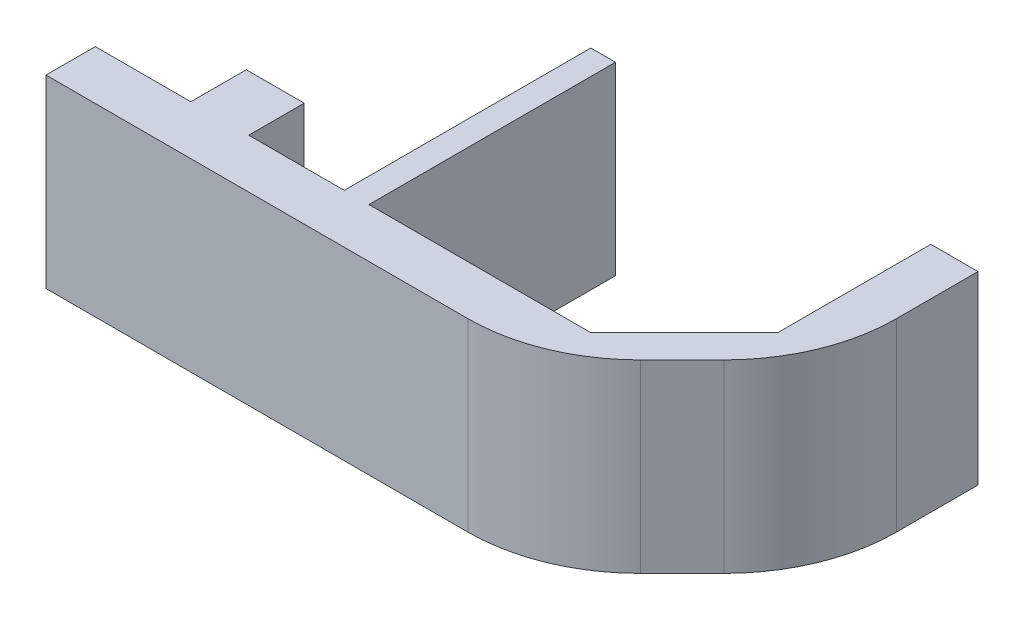
ISO-10303-21;
HEADER;
FILE_DESCRIPTION(('STEP AP214'),'2;1');
FILE_NAME('part.step','',(''),(''),'','','');
FILE_SCHEMA(('AUTOMOTIVE_DESIGN { 1 0 10303 214 1 1 1 1 }'));
ENDSEC;
DATA;
#1=APPLICATION_CONTEXT('core data for automotive mechanical design processes');
#2=APPLICATION_PROTOCOL_DEFINITION('international standard','automotive_design',2000,#1);
#3=PRODUCT_CONTEXT('',#1,'mechanical');
#4=PRODUCT('Part','Part','',(#3));
#5=PRODUCT_RELATED_PRODUCT_CATEGORY('part','',(#4));
#6=PRODUCT_DEFINITION_FORMATION('','',#4);
#7=PRODUCT_DEFINITION_CONTEXT('part definition',#1,'design');
#8=PRODUCT_DEFINITION('design','',#6,#7);
#9=PRODUCT_DEFINITION_SHAPE('','',#8);
#10=(LENGTH_UNIT() NAMED_UNIT(*) SI_UNIT(.MILLI.,.METRE.));
#11=(NAMED_UNIT(*) PLANE_ANGLE_UNIT() SI_UNIT($,.RADIAN.));
#12=(NAMED_UNIT(*) SI_UNIT($,.STERADIAN.) SOLID_ANGLE_UNIT());
#13=UNCERTAINTY_MEASURE_WITH_UNIT(LENGTH_MEASURE(1.E-05),#10,'distance_accuracy_value','');
#14=(GEOMETRIC_REPRESENTATION_CONTEXT(3) GLOBAL_UNCERTAINTY_ASSIGNED_CONTEXT((#13)) GLOBAL_UNIT_ASSIGNED_CONTEXT((#10,
#11,#12)) REPRESENTATION_CONTEXT('',''));
#15=CARTESIAN_POINT('',(0.,0.,0.));
#16=DIRECTION('',(0.,0.,1.));
#17=DIRECTION('',(1.,0.,0.));
#18=AXIS2_PLACEMENT_3D('',#15,#16,#17);
#19=CARTESIAN_POINT('',(-22.8017231924407,15.,-2.35925925925926));
#20=DIRECTION('',(0.,0.,1.));
#21=DIRECTION('',(1.,0.,0.));
#22=AXIS2_PLACEMENT_3D('',#19,#20,#21);
#23=PLANE('',#22);
#24=DIRECTION('',(0.,-1.,0.));
#25=VECTOR('',#24,1.);
#26=CARTESIAN_POINT('',(-13.0517231924407,15.,-2.35925925925926));
#27=LINE('',#26,#25);
#28=CARTESIAN_POINT('',(-13.0517231924407,15.,-2.35925925925926));
#29=VERTEX_POINT('',#28);
#30=CARTESIAN_POINT('',(-13.0517231924407,0.,-2.35925925925926));
#31=VERTEX_POINT('',#30);
#32=EDGE_CURVE('E60',#29,#31,#27,.T.);
#33=ORIENTED_EDGE('',*,*,#32,.F.);
#34=DIRECTION('',(-1.,0.,0.));
#35=VECTOR('',#34,1.);
#36=CARTESIAN_POINT('',(-22.8017231924407,15.,-2.35925925925926));
#37=LINE('',#36,#35);
#38=CARTESIAN_POINT('',(4.94827680755932,15.,-2.35925925925926));
#39=VERTEX_POINT('',#38);
#40=EDGE_CURVE('E219',#39,#29,#37,.T.);
#41=ORIENTED_EDGE('',*,*,#40,.F.);
#42=DIRECTION('',(0.,-1.,0.));
#43=VECTOR('',#42,1.);
#44=CARTESIAN_POINT('',(4.94827680755932,15.,-2.35925925925926));
#45=LINE('',#44,#43);
#46=CARTESIAN_POINT('',(4.94827680755932,0.,-2.35925925925926));
#47=VERTEX_POINT('',#46);
#48=EDGE_CURVE('E257',#39,#47,#45,.T.);
#49=ORIENTED_EDGE('',*,*,#48,.T.);
#50=DIRECTION('',(-1.,0.,0.));
#51=VECTOR('',#50,1.);
#52=CARTESIAN_POINT('',(-22.8017231924407,0.,-2.35925925925926));
#53=LINE('',#52,#51);
#54=EDGE_CURVE('E244',#47,#31,#53,.T.);
#55=ORIENTED_EDGE('',*,*,#54,.T.);
#56=EDGE_LOOP('',(#33,#41,#49,#55));
#57=FACE_BOUND('',#56,.T.);
#58=ADVANCED_FACE('F37',(#57),#23,.F.);
#59=DIRECTION('',(0.,1.,0.));
#60=VECTOR('',#59,1.);
#61=CARTESIAN_POINT('',(-15.0517231924407,15.,-2.35925925925926));
#62=LINE('',#61,#60);
#63=CARTESIAN_POINT('',(-15.0517231924407,0.,-2.35925925925926));
#64=VERTEX_POINT('',#63);
#65=CARTESIAN_POINT('',(-15.0517231924407,15.,-2.35925925925926));
#66=VERTEX_POINT('',#65);
#67=EDGE_CURVE('E185',#64,#66,#62,.T.);
#68=ORIENTED_EDGE('',*,*,#67,.F.);
#69=CARTESIAN_POINT('',(-22.8017231924407,0.,-2.35925925925926));
#70=VERTEX_POINT('',#69);
#71=EDGE_CURVE('E243',#64,#70,#53,.T.);
#72=ORIENTED_EDGE('',*,*,#71,.T.);
#73=DIRECTION('',(0.,-1.,0.));
#74=VECTOR('',#73,1.);
#75=CARTESIAN_POINT('',(-22.8017231924407,15.,-2.35925925925926));
#76=LINE('',#75,#74);
#77=CARTESIAN_POINT('',(-22.8017231924407,15.,-2.35925925925926));
#78=VERTEX_POINT('',#77);
#79=EDGE_CURVE('E254',#78,#70,#76,.T.);
#80=ORIENTED_EDGE('',*,*,#79,.F.);
#81=EDGE_CURVE('E52',#66,#78,#37,.T.);
#82=ORIENTED_EDGE('',*,*,#81,.F.);
#83=EDGE_LOOP('',(#68,#72,#80,#82));
#84=FACE_BOUND('',#83,.T.);
#85=ADVANCED_FACE('F329',(#84),#23,.F.);
#86=CARTESIAN_POINT('',(-27.5017231924407,15.,-6.85925925925926));
#87=DIRECTION('',(1.,0.,0.));
#88=DIRECTION('',(0.,0.,-1.));
#89=AXIS2_PLACEMENT_3D('',#86,#87,#88);
#90=PLANE('',#89);
#91=DIRECTION('',(0.,0.,1.));
#92=VECTOR('',#91,1.);
#93=CARTESIAN_POINT('',(-27.5017231924407,0.,-6.85925925925926));
#94=LINE('',#93,#92);
#95=CARTESIAN_POINT('',(-27.5017231924407,0.,-6.85925925925926));
#96=VERTEX_POINT('',#95);
#97=CARTESIAN_POINT('',(-27.5017231924407,0.,-2.35925925925926));
#98=VERTEX_POINT('',#97);
#99=EDGE_CURVE('E188',#96,#98,#94,.T.);
#100=ORIENTED_EDGE('',*,*,#99,.T.);
#101=DIRECTION('',(0.,-1.,0.));
#102=VECTOR('',#101,1.);
#103=CARTESIAN_POINT('',(-27.5017231924407,15.,-2.35925925925926));
#104=LINE('',#103,#102);
#105=CARTESIAN_POINT('',(-27.5017231924407,15.,-2.35925925925926));
#106=VERTEX_POINT('',#105);
#107=EDGE_CURVE('E275',#106,#98,#104,.T.);
#108=ORIENTED_EDGE('',*,*,#107,.F.);
#109=DIRECTION('',(0.,0.,1.));
#110=VECTOR('',#109,1.);
#111=CARTESIAN_POINT('',(-27.5017231924407,15.,-6.85925925925926));
#112=LINE('',#111,#110);
#113=CARTESIAN_POINT('',(-27.5017231924407,15.,-6.85925925925926));
#114=VERTEX_POINT('',#113);
#115=EDGE_CURVE('E197',#114,#106,#112,.T.);
#116=ORIENTED_EDGE('',*,*,#115,.F.);
#117=DIRECTION('',(0.,-1.,0.));
#118=VECTOR('',#117,1.);
#119=CARTESIAN_POINT('',(-27.5017231924407,15.,-6.85925925925926));
#120=LINE('',#119,#118);
#121=EDGE_CURVE('E224',#114,#96,#120,.T.);
#122=ORIENTED_EDGE('',*,*,#121,.T.);
#123=EDGE_LOOP('',(#100,#108,#116,#122));
#124=FACE_BOUND('',#123,.T.);
#125=ADVANCED_FACE('F319',(#124),#90,.F.);
#126=CARTESIAN_POINT('',(-27.5017231924407,15.,-2.35925925925926));
#127=DIRECTION('',(0.,0.,1.));
#128=DIRECTION('',(1.,0.,0.));
#129=AXIS2_PLACEMENT_3D('',#126,#127,#128);
#130=PLANE('',#129);
#131=DIRECTION('',(-1.,0.,0.));
#132=VECTOR('',#131,1.);
#133=CARTESIAN_POINT('',(-27.5017231924407,0.,-2.35925925925926));
#134=LINE('',#133,#132);
#135=CARTESIAN_POINT('',(-35.2517231924407,0.,-2.35925925925926));
#136=VERTEX_POINT('',#135);
#137=EDGE_CURVE('E191',#98,#136,#134,.T.);
#138=ORIENTED_EDGE('',*,*,#137,.T.);
#139=DIRECTION('',(0.,-1.,0.));
#140=VECTOR('',#139,1.);
#141=CARTESIAN_POINT('',(-35.2517231924407,15.,-2.35925925925926));
#142=LINE('',#141,#140);
#143=CARTESIAN_POINT('',(-35.2517231924407,15.,-2.35925925925926));
#144=VERTEX_POINT('',#143);
#145=EDGE_CURVE('E272',#144,#136,#142,.T.);
#146=ORIENTED_EDGE('',*,*,#145,.F.);
#147=DIRECTION('',(-1.,0.,0.));
#148=VECTOR('',#147,1.);
#149=CARTESIAN_POINT('',(-27.5017231924407,15.,-2.35925925925926));
#150=LINE('',#149,#148);
#151=EDGE_CURVE('E200',#106,#144,#150,.T.);
#152=ORIENTED_EDGE('',*,*,#151,.F.);
#153=ORIENTED_EDGE('',*,*,#107,.T.);
#154=EDGE_LOOP('',(#138,#146,#152,#153));
#155=FACE_BOUND('',#154,.T.);
#156=ADVANCED_FACE('F316',(#155),#130,.F.);
#157=CARTESIAN_POINT('',(-35.2517231924407,15.,-2.35925925925926));
#158=DIRECTION('',(1.,0.,0.));
#159=DIRECTION('',(0.,0.,-1.));
#160=AXIS2_PLACEMENT_3D('',#157,#158,#159);
#161=PLANE('',#160);
#162=DIRECTION('',(0.,0.,1.));
#163=VECTOR('',#162,1.);
#164=CARTESIAN_POINT('',(-35.2517231924407,0.,-2.35925925925926));
#165=LINE('',#164,#163);
#166=CARTESIAN_POINT('',(-35.2517231924407,0.,1.64074074074074));
#167=VERTEX_POINT('',#166);
#168=EDGE_CURVE('E227',#136,#167,#165,.T.);
#169=ORIENTED_EDGE('',*,*,#168,.T.);
#170=DIRECTION('',(0.,-1.,0.));
#171=VECTOR('',#170,1.);
#172=CARTESIAN_POINT('',(-35.2517231924407,15.,1.64074074074074));
#173=LINE('',#172,#171);
#174=CARTESIAN_POINT('',(-35.2517231924407,15.,1.64074074074074));
#175=VERTEX_POINT('',#174);
#176=EDGE_CURVE('E269',#175,#167,#173,.T.);
#177=ORIENTED_EDGE('',*,*,#176,.F.);
#178=DIRECTION('',(0.,0.,1.));
#179=VECTOR('',#178,1.);
#180=CARTESIAN_POINT('',(-35.2517231924407,15.,-2.35925925925926));
#181=LINE('',#180,#179);
#182=EDGE_CURVE('E203',#144,#175,#181,.T.);
#183=ORIENTED_EDGE('',*,*,#182,.F.);
#184=ORIENTED_EDGE('',*,*,#145,.T.);
#185=EDGE_LOOP('',(#169,#177,#183,#184));
#186=FACE_BOUND('',#185,.T.);
#187=ADVANCED_FACE('F310',(#186),#161,.F.);
#188=CARTESIAN_POINT('',(-35.2517231924407,15.,1.64074074074074));
#189=DIRECTION('',(0.,0.,-1.));
#190=DIRECTION('',(-1.,0.,0.));
#191=AXIS2_PLACEMENT_3D('',#188,#189,#190);
#192=PLANE('',#191);
#193=DIRECTION('',(1.,0.,0.));
#194=VECTOR('',#193,1.);
#195=CARTESIAN_POINT('',(-35.2517231924407,0.,1.64074074074074));
#196=LINE('',#195,#194);
#197=CARTESIAN_POINT('',(-1.02071306566402,0.,1.64074074074074));
#198=VERTEX_POINT('',#197);
#199=EDGE_CURVE('E229',#167,#198,#196,.T.);
#200=ORIENTED_EDGE('',*,*,#199,.T.);
#201=DIRECTION('',(0.,-1.,0.));
#202=VECTOR('',#201,1.);
#203=CARTESIAN_POINT('',(-1.02071306566402,15.,1.64074074074074));
#204=LINE('',#203,#202);
#205=CARTESIAN_POINT('',(-1.02071306566402,15.,1.64074074074074));
#206=VERTEX_POINT('',#205);
#207=EDGE_CURVE('E287',#198,#206,#204,.F.);
#208=ORIENTED_EDGE('',*,*,#207,.T.);
#209=DIRECTION('',(1.,0.,0.));
#210=VECTOR('',#209,1.);
#211=CARTESIAN_POINT('',(-35.2517231924407,15.,1.64074074074074));
#212=LINE('',#211,#210);
#213=EDGE_CURVE('E205',#175,#206,#212,.T.);
#214=ORIENTED_EDGE('',*,*,#213,.F.);
#215=ORIENTED_EDGE('',*,*,#176,.T.);
#216=EDGE_LOOP('',(#200,#208,#214,#215));
#217=FACE_BOUND('',#216,.T.);
#218=ADVANCED_FACE('F306',(#217),#192,.F.);
#219=CARTESIAN_POINT('',(4.77827680755932,15.,1.64074074074074));
#220=DIRECTION('',(-0.707106781186547,0.,-0.707106781186548));
#221=DIRECTION('',(-0.707106781186548,0.,0.707106781186547));
#222=AXIS2_PLACEMENT_3D('',#219,#220,#221);
#223=PLANE('',#222);
#224=DIRECTION('',(0.707106781186548,0.,-0.707106781186547));
#225=VECTOR('',#224,1.);
#226=CARTESIAN_POINT('',(4.77827680755932,15.,1.64074074074074));
#227=LINE('',#226,#225);
#228=CARTESIAN_POINT('',(8.87878187094765,15.,-2.45976432264759));
#229=VERTEX_POINT('',#228);
#230=CARTESIAN_POINT('',(12.2611050775043,15.,-5.84208752920422));
#231=VERTEX_POINT('',#230);
#232=EDGE_CURVE('E208',#229,#231,#227,.T.);
#233=ORIENTED_EDGE('',*,*,#232,.F.);
#234=DIRECTION('',(0.,-1.,0.));
#235=VECTOR('',#234,1.);
#236=CARTESIAN_POINT('',(8.87878187094765,15.,-2.45976432264759));
#237=LINE('',#236,#235);
#238=CARTESIAN_POINT('',(8.87878187094765,0.,-2.45976432264759));
#239=VERTEX_POINT('',#238);
#240=EDGE_CURVE('E280',#229,#239,#237,.T.);
#241=ORIENTED_EDGE('',*,*,#240,.T.);
#242=DIRECTION('',(0.707106781186548,0.,-0.707106781186547));
#243=VECTOR('',#242,1.);
#244=CARTESIAN_POINT('',(4.77827680755932,0.,1.64074074074074));
#245=LINE('',#244,#243);
#246=CARTESIAN_POINT('',(12.2611050775043,0.,-5.84208752920422));
#247=VERTEX_POINT('',#246);
#248=EDGE_CURVE('E232',#239,#247,#245,.T.);
#249=ORIENTED_EDGE('',*,*,#248,.T.);
#250=DIRECTION('',(0.,-1.,0.));
#251=VECTOR('',#250,1.);
#252=CARTESIAN_POINT('',(12.2611050775043,15.,-5.84208752920422));
#253=LINE('',#252,#251);
#254=EDGE_CURVE('E278',#247,#231,#253,.F.);
#255=ORIENTED_EDGE('',*,*,#254,.T.);
#256=EDGE_LOOP('',(#233,#241,#249,#255));
#257=FACE_BOUND('',#256,.T.);
#258=ADVANCED_FACE('F300',(#257),#223,.F.);
#259=CARTESIAN_POINT('',(16.3616101408926,15.,-22.3592592592593));
#260=DIRECTION('',(-1.,0.,0.));
#261=DIRECTION('',(0.,0.,1.));
#262=AXIS2_PLACEMENT_3D('',#259,#260,#261);
#263=PLANE('',#262);
#264=DIRECTION('',(0.,0.,-1.));
#265=VECTOR('',#264,1.);
#266=CARTESIAN_POINT('',(16.3616101408926,15.,-22.3592592592593));
#267=LINE('',#266,#265);
#268=CARTESIAN_POINT('',(16.3616101408926,15.,-15.7415824658159));
#269=VERTEX_POINT('',#268);
#270=CARTESIAN_POINT('',(16.3616101408926,15.,-22.3592592592593));
#271=VERTEX_POINT('',#270);
#272=EDGE_CURVE('E211',#269,#271,#267,.T.);
#273=ORIENTED_EDGE('',*,*,#272,.F.);
#274=DIRECTION('',(0.,-1.,0.));
#275=VECTOR('',#274,1.);
#276=CARTESIAN_POINT('',(16.3616101408926,15.,-15.7415824658159));
#277=LINE('',#276,#275);
#278=CARTESIAN_POINT('',(16.3616101408926,0.,-15.7415824658159));
#279=VERTEX_POINT('',#278);
#280=EDGE_CURVE('E11',#269,#279,#277,.T.);
#281=ORIENTED_EDGE('',*,*,#280,.T.);
#282=DIRECTION('',(0.,0.,-1.));
#283=VECTOR('',#282,1.);
#284=CARTESIAN_POINT('',(16.3616101408926,0.,-22.3592592592593));
#285=LINE('',#284,#283);
#286=CARTESIAN_POINT('',(16.3616101408926,0.,-22.3592592592593));
#287=VERTEX_POINT('',#286);
#288=EDGE_CURVE('E235',#279,#287,#285,.T.);
#289=ORIENTED_EDGE('',*,*,#288,.T.);
#290=DIRECTION('',(0.,-1.,0.));
#291=VECTOR('',#290,1.);
#292=CARTESIAN_POINT('',(16.3616101408926,15.,-22.3592592592593));
#293=LINE('',#292,#291);
#294=EDGE_CURVE('E266',#271,#287,#293,.T.);
#295=ORIENTED_EDGE('',*,*,#294,.F.);
#296=EDGE_LOOP('',(#273,#281,#289,#295));
#297=FACE_BOUND('',#296,.T.);
#298=ADVANCED_FACE('F359',(#297),#263,.F.);
#299=CARTESIAN_POINT('',(12.5316101408926,15.,-22.3592592592593));
#300=DIRECTION('',(0.,0.,1.));
#301=DIRECTION('',(1.,0.,0.));
#302=AXIS2_PLACEMENT_3D('',#299,#300,#301);
#303=PLANE('',#302);
#304=DIRECTION('',(-1.,0.,0.));
#305=VECTOR('',#304,1.);
#306=CARTESIAN_POINT('',(12.5316101408926,0.,-22.3592592592593));
#307=LINE('',#306,#305);
#308=CARTESIAN_POINT('',(12.5316101408926,0.,-22.3592592592593));
#309=VERTEX_POINT('',#308);
#310=EDGE_CURVE('E237',#287,#309,#307,.T.);
#311=ORIENTED_EDGE('',*,*,#310,.T.);
#312=DIRECTION('',(0.,-1.,0.));
#313=VECTOR('',#312,1.);
#314=CARTESIAN_POINT('',(12.5316101408926,15.,-22.3592592592593));
#315=LINE('',#314,#313);
#316=CARTESIAN_POINT('',(12.5316101408926,15.,-22.3592592592593));
#317=VERTEX_POINT('',#316);
#318=EDGE_CURVE('E263',#317,#309,#315,.T.);
#319=ORIENTED_EDGE('',*,*,#318,.F.);
#320=DIRECTION('',(-1.,0.,0.));
#321=VECTOR('',#320,1.);
#322=CARTESIAN_POINT('',(12.5316101408926,15.,-22.3592592592593));
#323=LINE('',#322,#321);
#324=EDGE_CURVE('E213',#271,#317,#323,.T.);
#325=ORIENTED_EDGE('',*,*,#324,.F.);
#326=ORIENTED_EDGE('',*,*,#294,.T.);
#327=EDGE_LOOP('',(#311,#319,#325,#326));
#328=FACE_BOUND('',#327,.T.);
#329=ADVANCED_FACE('F354',(#328),#303,.F.);
#330=CARTESIAN_POINT('',(12.5316101408926,15.,-9.94259259259256));
#331=DIRECTION('',(1.,0.,0.));
#332=DIRECTION('',(0.,0.,-1.));
#333=AXIS2_PLACEMENT_3D('',#330,#331,#332);
#334=PLANE('',#333);
#335=DIRECTION('',(0.,0.,1.));
#336=VECTOR('',#335,1.);
#337=CARTESIAN_POINT('',(12.5316101408926,0.,-9.94259259259256));
#338=LINE('',#337,#336);
#339=CARTESIAN_POINT('',(12.5316101408926,0.,-9.94259259259256));
#340=VERTEX_POINT('',#339);
#341=EDGE_CURVE('E239',#309,#340,#338,.T.);
#342=ORIENTED_EDGE('',*,*,#341,.T.);
#343=DIRECTION('',(0.,-1.,0.));
#344=VECTOR('',#343,1.);
#345=CARTESIAN_POINT('',(12.5316101408926,15.,-9.94259259259256));
#346=LINE('',#345,#344);
#347=CARTESIAN_POINT('',(12.5316101408926,15.,-9.94259259259256));
#348=VERTEX_POINT('',#347);
#349=EDGE_CURVE('E260',#348,#340,#346,.T.);
#350=ORIENTED_EDGE('',*,*,#349,.F.);
#351=DIRECTION('',(0.,0.,1.));
#352=VECTOR('',#351,1.);
#353=CARTESIAN_POINT('',(12.5316101408926,15.,-9.94259259259256));
#354=LINE('',#353,#352);
#355=EDGE_CURVE('E215',#317,#348,#354,.T.);
#356=ORIENTED_EDGE('',*,*,#355,.F.);
#357=ORIENTED_EDGE('',*,*,#318,.T.);
#358=EDGE_LOOP('',(#342,#350,#356,#357));
#359=FACE_BOUND('',#358,.T.);
#360=ADVANCED_FACE('F350',(#359),#334,.F.);
#361=CARTESIAN_POINT('',(4.94827680755932,15.,-2.35925925925926));
#362=DIRECTION('',(0.707106781186548,0.,0.707106781186547));
#363=DIRECTION('',(0.707106781186547,0.,-0.707106781186548));
#364=AXIS2_PLACEMENT_3D('',#361,#362,#363);
#365=PLANE('',#364);
#366=DIRECTION('',(-0.707106781186547,0.,0.707106781186548));
#367=VECTOR('',#366,1.);
#368=CARTESIAN_POINT('',(4.94827680755932,0.,-2.35925925925926));
#369=LINE('',#368,#367);
#370=EDGE_CURVE('E241',#340,#47,#369,.T.);
#371=ORIENTED_EDGE('',*,*,#370,.T.);
#372=ORIENTED_EDGE('',*,*,#48,.F.);
#373=DIRECTION('',(-0.707106781186547,0.,0.707106781186548));
#374=VECTOR('',#373,1.);
#375=CARTESIAN_POINT('',(4.94827680755932,15.,-2.35925925925926));
#376=LINE('',#375,#374);
#377=EDGE_CURVE('E217',#348,#39,#376,.T.);
#378=ORIENTED_EDGE('',*,*,#377,.F.);
#379=ORIENTED_EDGE('',*,*,#349,.T.);
#380=EDGE_LOOP('',(#371,#372,#378,#379));
#381=FACE_BOUND('',#380,.T.);
#382=ADVANCED_FACE('F346',(#381),#365,.F.);
#383=CARTESIAN_POINT('',(-22.8017231924407,15.,-6.85925925925926));
#384=DIRECTION('',(-1.,0.,0.));
#385=DIRECTION('',(0.,0.,1.));
#386=AXIS2_PLACEMENT_3D('',#383,#384,#385);
#387=PLANE('',#386);
#388=DIRECTION('',(0.,0.,-1.));
#389=VECTOR('',#388,1.);
#390=CARTESIAN_POINT('',(-22.8017231924407,0.,-6.85925925925926));
#391=LINE('',#390,#389);
#392=CARTESIAN_POINT('',(-22.8017231924407,0.,-6.85925925925926));
#393=VERTEX_POINT('',#392);
#394=EDGE_CURVE('E246',#70,#393,#391,.T.);
#395=ORIENTED_EDGE('',*,*,#394,.T.);
#396=DIRECTION('',(0.,-1.,0.));
#397=VECTOR('',#396,1.);
#398=CARTESIAN_POINT('',(-22.8017231924407,15.,-6.85925925925926));
#399=LINE('',#398,#397);
#400=CARTESIAN_POINT('',(-22.8017231924407,15.,-6.85925925925926));
#401=VERTEX_POINT('',#400);
#402=EDGE_CURVE('E251',#401,#393,#399,.T.);
#403=ORIENTED_EDGE('',*,*,#402,.F.);
#404=DIRECTION('',(0.,0.,-1.));
#405=VECTOR('',#404,1.);
#406=CARTESIAN_POINT('',(-22.8017231924407,15.,-6.85925925925926));
#407=LINE('',#406,#405);
#408=EDGE_CURVE('E221',#78,#401,#407,.T.);
#409=ORIENTED_EDGE('',*,*,#408,.F.);
#410=ORIENTED_EDGE('',*,*,#79,.T.);
#411=EDGE_LOOP('',(#395,#403,#409,#410));
#412=FACE_BOUND('',#411,.T.);
#413=ADVANCED_FACE('F327',(#412),#387,.F.);
#414=CARTESIAN_POINT('',(-27.5017231924407,15.,-6.85925925925926));
#415=DIRECTION('',(0.,0.,1.));
#416=DIRECTION('',(1.,0.,0.));
#417=AXIS2_PLACEMENT_3D('',#414,#415,#416);
#418=PLANE('',#417);
#419=DIRECTION('',(-1.,0.,0.));
#420=VECTOR('',#419,1.);
#421=CARTESIAN_POINT('',(-27.5017231924407,0.,-6.85925925925926));
#422=LINE('',#421,#420);
#423=EDGE_CURVE('E201',#393,#96,#422,.T.);
#424=ORIENTED_EDGE('',*,*,#423,.T.);
#425=ORIENTED_EDGE('',*,*,#121,.F.);
#426=DIRECTION('',(-1.,0.,0.));
#427=VECTOR('',#426,1.);
#428=CARTESIAN_POINT('',(-27.5017231924407,15.,-6.85925925925926));
#429=LINE('',#428,#427);
#430=EDGE_CURVE('E223',#401,#114,#429,.T.);
#431=ORIENTED_EDGE('',*,*,#430,.F.);
#432=ORIENTED_EDGE('',*,*,#402,.T.);
#433=EDGE_LOOP('',(#424,#425,#431,#432));
#434=FACE_BOUND('',#433,.T.);
#435=ADVANCED_FACE('F323',(#434),#418,.F.);
#436=CARTESIAN_POINT('',(0.,15.,0.));
#437=DIRECTION('',(0.,-1.,0.));
#438=DIRECTION('',(0.,0.,-1.));
#439=AXIS2_PLACEMENT_3D('',#436,#437,#438);
#440=PLANE('',#439);
#441=ORIENTED_EDGE('',*,*,#213,.T.);
#442=CARTESIAN_POINT('',(-1.02071306566401,15.,-12.3592592592593));
#443=DIRECTION('',(0.,-1.,0.));
#444=DIRECTION('',(0.,0.,-1.));
#445=AXIS2_PLACEMENT_3D('',#442,#443,#444);
#446=CIRCLE('',#445,14.);
#447=EDGE_CURVE('E45',#206,#229,#446,.F.);
#448=ORIENTED_EDGE('',*,*,#447,.T.);
#449=ORIENTED_EDGE('',*,*,#232,.T.);
#450=CARTESIAN_POINT('',(2.36161014089262,15.,-15.7415824658159));
#451=DIRECTION('',(0.,-1.,0.));
#452=DIRECTION('',(0.,0.,-1.));
#453=AXIS2_PLACEMENT_3D('',#450,#451,#452);
#454=CIRCLE('',#453,14.);
#455=EDGE_CURVE('E289',#231,#269,#454,.F.);
#456=ORIENTED_EDGE('',*,*,#455,.T.);
#457=ORIENTED_EDGE('',*,*,#272,.T.);
#458=ORIENTED_EDGE('',*,*,#324,.T.);
#459=ORIENTED_EDGE('',*,*,#355,.T.);
#460=ORIENTED_EDGE('',*,*,#377,.T.);
#461=ORIENTED_EDGE('',*,*,#40,.T.);
#462=DIRECTION('',(0.,0.,1.));
#463=VECTOR('',#462,1.);
#464=CARTESIAN_POINT('',(-13.0517231924407,15.,-22.3592592592593));
#465=LINE('',#464,#463);
#466=CARTESIAN_POINT('',(-13.0517231924407,15.,-22.3592592592593));
#467=VERTEX_POINT('',#466);
#468=EDGE_CURVE('E336',#467,#29,#465,.T.);
#469=ORIENTED_EDGE('',*,*,#468,.F.);
#470=DIRECTION('',(1.,0.,0.));
#471=VECTOR('',#470,1.);
#472=CARTESIAN_POINT('',(-13.0517231924407,15.,-22.3592592592593));
#473=LINE('',#472,#471);
#474=CARTESIAN_POINT('',(-15.0517231924407,15.,-22.3592592592593));
#475=VERTEX_POINT('',#474);
#476=EDGE_CURVE('E181',#475,#467,#473,.T.);
#477=ORIENTED_EDGE('',*,*,#476,.F.);
#478=DIRECTION('',(0.,0.,1.));
#479=VECTOR('',#478,1.);
#480=CARTESIAN_POINT('',(-15.0517231924407,15.,-22.3592592592593));
#481=LINE('',#480,#479);
#482=EDGE_CURVE('E193',#475,#66,#481,.T.);
#483=ORIENTED_EDGE('',*,*,#482,.T.);
#484=ORIENTED_EDGE('',*,*,#81,.T.);
#485=ORIENTED_EDGE('',*,*,#408,.T.);
#486=ORIENTED_EDGE('',*,*,#430,.T.);
#487=ORIENTED_EDGE('',*,*,#115,.T.);
#488=ORIENTED_EDGE('',*,*,#151,.T.);
#489=ORIENTED_EDGE('',*,*,#182,.T.);
#490=EDGE_LOOP('',(#441,#448,#449,#456,#457,#458,#459,#460,#461,#469,#477,#483,#484,#485,#486,
#487,#488,#489));
#491=FACE_BOUND('',#490,.T.);
#492=ADVANCED_FACE('F293',(#491),#440,.F.);
#493=CARTESIAN_POINT('',(0.,0.,0.));
#494=DIRECTION('',(0.,-1.,0.));
#495=DIRECTION('',(0.,0.,-1.));
#496=AXIS2_PLACEMENT_3D('',#493,#494,#495);
#497=PLANE('',#496);
#498=ORIENTED_EDGE('',*,*,#248,.F.);
#499=CARTESIAN_POINT('',(-1.02071306566401,0.,-12.3592592592593));
#500=DIRECTION('',(0.,-1.,0.));
#501=DIRECTION('',(0.,0.,-1.));
#502=AXIS2_PLACEMENT_3D('',#499,#500,#501);
#503=CIRCLE('',#502,14.);
#504=EDGE_CURVE('E285',#239,#198,#503,.T.);
#505=ORIENTED_EDGE('',*,*,#504,.T.);
#506=ORIENTED_EDGE('',*,*,#199,.F.);
#507=ORIENTED_EDGE('',*,*,#168,.F.);
#508=ORIENTED_EDGE('',*,*,#137,.F.);
#509=ORIENTED_EDGE('',*,*,#99,.F.);
#510=ORIENTED_EDGE('',*,*,#423,.F.);
#511=ORIENTED_EDGE('',*,*,#394,.F.);
#512=ORIENTED_EDGE('',*,*,#71,.F.);
#513=DIRECTION('',(0.,0.,1.));
#514=VECTOR('',#513,1.);
#515=CARTESIAN_POINT('',(-15.0517231924407,0.,-22.3592592592593));
#516=LINE('',#515,#514);
#517=CARTESIAN_POINT('',(-15.0517231924407,0.,-22.3592592592593));
#518=VERTEX_POINT('',#517);
#519=EDGE_CURVE('E172',#518,#64,#516,.T.);
#520=ORIENTED_EDGE('',*,*,#519,.F.);
#521=DIRECTION('',(-1.,0.,0.));
#522=VECTOR('',#521,1.);
#523=CARTESIAN_POINT('',(-13.0517231924407,0.,-22.3592592592593));
#524=LINE('',#523,#522);
#525=CARTESIAN_POINT('',(-13.0517231924407,0.,-22.3592592592593));
#526=VERTEX_POINT('',#525);
#527=EDGE_CURVE('E164',#526,#518,#524,.T.);
#528=ORIENTED_EDGE('',*,*,#527,.F.);
#529=DIRECTION('',(0.,0.,1.));
#530=VECTOR('',#529,1.);
#531=CARTESIAN_POINT('',(-13.0517231924407,0.,-22.3592592592593));
#532=LINE('',#531,#530);
#533=EDGE_CURVE('E170',#526,#31,#532,.T.);
#534=ORIENTED_EDGE('',*,*,#533,.T.);
#535=ORIENTED_EDGE('',*,*,#54,.F.);
#536=ORIENTED_EDGE('',*,*,#370,.F.);
#537=ORIENTED_EDGE('',*,*,#341,.F.);
#538=ORIENTED_EDGE('',*,*,#310,.F.);
#539=ORIENTED_EDGE('',*,*,#288,.F.);
#540=CARTESIAN_POINT('',(2.36161014089262,0.,-15.7415824658159));
#541=DIRECTION('',(0.,-1.,0.));
#542=DIRECTION('',(0.,0.,-1.));
#543=AXIS2_PLACEMENT_3D('',#540,#541,#542);
#544=CIRCLE('',#543,14.);
#545=EDGE_CURVE('E283',#279,#247,#544,.T.);
#546=ORIENTED_EDGE('',*,*,#545,.T.);
#547=EDGE_LOOP('',(#498,#505,#506,#507,#508,#509,#510,#511,#512,#520,#528,#534,#535,#536,#537,
#538,#539,#546));
#548=FACE_BOUND('',#547,.T.);
#549=ADVANCED_FACE('F167',(#548),#497,.T.);
#550=CARTESIAN_POINT('',(-1.02071306566401,15.,-12.3592592592593));
#551=DIRECTION('',(0.,-1.,0.));
#552=DIRECTION('',(0.,0.,-1.));
#553=AXIS2_PLACEMENT_3D('',#550,#551,#552);
#554=CYLINDRICAL_SURFACE('',#553,14.);
#555=ORIENTED_EDGE('',*,*,#447,.F.);
#556=ORIENTED_EDGE('',*,*,#207,.F.);
#557=ORIENTED_EDGE('',*,*,#504,.F.);
#558=ORIENTED_EDGE('',*,*,#240,.F.);
#559=EDGE_LOOP('',(#555,#556,#557,#558));
#560=FACE_BOUND('',#559,.T.);
#561=ADVANCED_FACE('F302',(#560),#554,.T.);
#562=CARTESIAN_POINT('',(2.36161014089262,15.,-15.7415824658159));
#563=DIRECTION('',(0.,-1.,0.));
#564=DIRECTION('',(0.,0.,-1.));
#565=AXIS2_PLACEMENT_3D('',#562,#563,#564);
#566=CYLINDRICAL_SURFACE('',#565,14.);
#567=ORIENTED_EDGE('',*,*,#455,.F.);
#568=ORIENTED_EDGE('',*,*,#254,.F.);
#569=ORIENTED_EDGE('',*,*,#545,.F.);
#570=ORIENTED_EDGE('',*,*,#280,.F.);
#571=EDGE_LOOP('',(#567,#568,#569,#570));
#572=FACE_BOUND('',#571,.T.);
#573=ADVANCED_FACE('F39',(#572),#566,.T.);
#574=CARTESIAN_POINT('',(-13.0517231924407,15.,-22.3592592592593));
#575=DIRECTION('',(-1.,0.,0.));
#576=DIRECTION('',(0.,0.,1.));
#577=AXIS2_PLACEMENT_3D('',#574,#575,#576);
#578=PLANE('',#577);
#579=ORIENTED_EDGE('',*,*,#32,.T.);
#580=ORIENTED_EDGE('',*,*,#533,.F.);
#581=DIRECTION('',(0.,-1.,0.));
#582=VECTOR('',#581,1.);
#583=CARTESIAN_POINT('',(-13.0517231924407,15.,-22.3592592592593));
#584=LINE('',#583,#582);
#585=EDGE_CURVE('E176',#467,#526,#584,.T.);
#586=ORIENTED_EDGE('',*,*,#585,.F.);
#587=ORIENTED_EDGE('',*,*,#468,.T.);
#588=EDGE_LOOP('',(#579,#580,#586,#587));
#589=FACE_BOUND('',#588,.T.);
#590=ADVANCED_FACE('F187',(#589),#578,.F.);
#591=CARTESIAN_POINT('',(-15.0517231924407,15.,-22.3592592592593));
#592=DIRECTION('',(1.,0.,0.));
#593=DIRECTION('',(0.,1.,0.));
#594=AXIS2_PLACEMENT_3D('',#591,#592,#593);
#595=PLANE('',#594);
#596=ORIENTED_EDGE('',*,*,#67,.T.);
#597=ORIENTED_EDGE('',*,*,#482,.F.);
#598=DIRECTION('',(0.,1.,0.));
#599=VECTOR('',#598,1.);
#600=CARTESIAN_POINT('',(-15.0517231924407,15.,-22.3592592592593));
#601=LINE('',#600,#599);
#602=EDGE_CURVE('E175',#518,#475,#601,.T.);
#603=ORIENTED_EDGE('',*,*,#602,.F.);
#604=ORIENTED_EDGE('',*,*,#519,.T.);
#605=EDGE_LOOP('',(#596,#597,#603,#604));
#606=FACE_BOUND('',#605,.T.);
#607=ADVANCED_FACE('F334',(#606),#595,.F.);
#608=CARTESIAN_POINT('',(0.,0.,-22.3592592592593));
#609=DIRECTION('',(0.,0.,-1.));
#610=DIRECTION('',(-1.,0.,0.));
#611=AXIS2_PLACEMENT_3D('',#608,#609,#610);
#612=PLANE('',#611);
#613=ORIENTED_EDGE('',*,*,#585,.T.);
#614=ORIENTED_EDGE('',*,*,#527,.T.);
#615=ORIENTED_EDGE('',*,*,#602,.T.);
#616=ORIENTED_EDGE('',*,*,#476,.T.);
#617=EDGE_LOOP('',(#613,#614,#615,#616));
#618=FACE_BOUND('',#617,.T.);
#619=ADVANCED_FACE('F179',(#618),#612,.T.);
#620=CLOSED_SHELL('',(#58,#85,#125,#156,#187,#218,#258,#298,#329,#360,#382,#413,#435,#492,#549,
#561,#573,#590,#607,#619));
#621=MANIFOLD_SOLID_BREP('B2',#620);
#622=ADVANCED_BREP_SHAPE_REPRESENTATION('',(#18,#621),#14);
#623=SHAPE_DEFINITION_REPRESENTATION(#9,#622);
ENDSEC;
END-ISO-10303-21;
